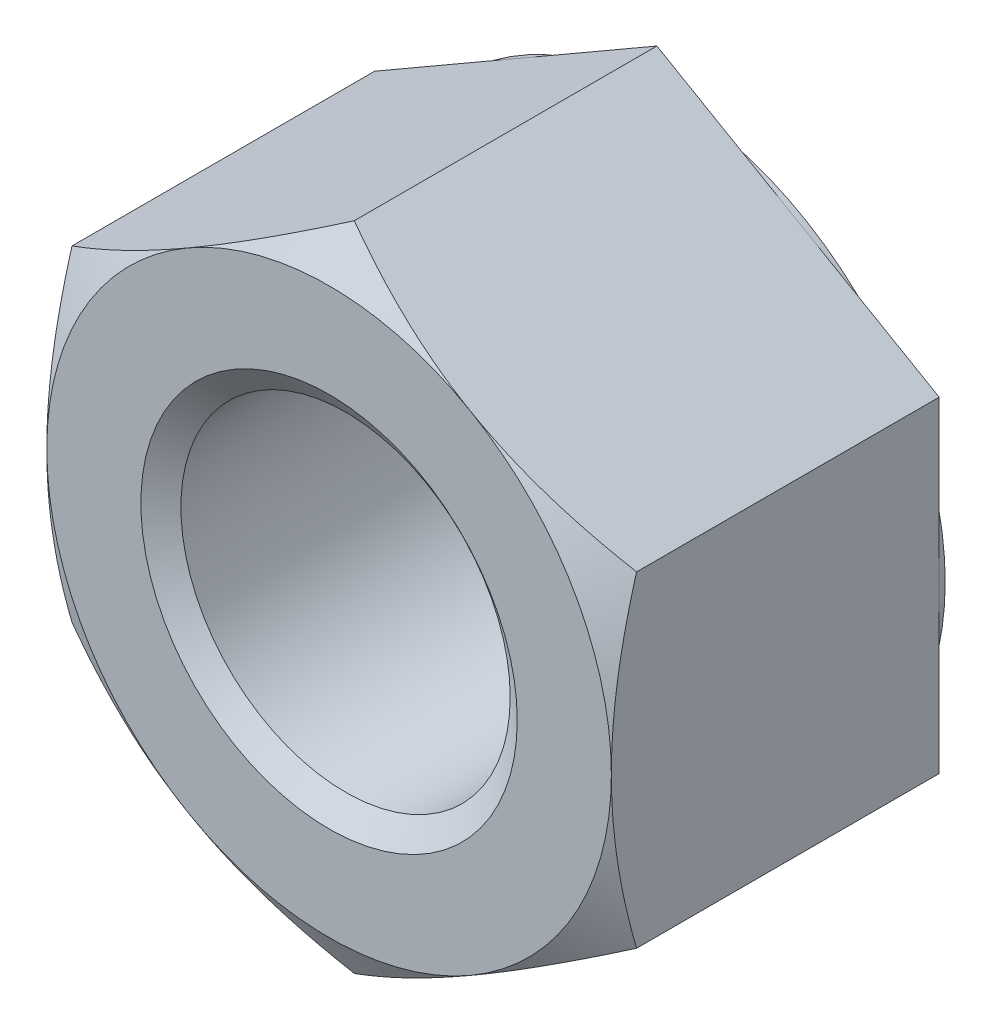
ISO-10303-21;
HEADER;
FILE_DESCRIPTION(('STEP AP214'),'2;1');
FILE_NAME('part.step','',(''),(''),'','','');
FILE_SCHEMA(('AUTOMOTIVE_DESIGN { 1 0 10303 214 1 1 1 1 }'));
ENDSEC;
DATA;
#1=APPLICATION_CONTEXT('core data for automotive mechanical design processes');
#2=APPLICATION_PROTOCOL_DEFINITION('international standard','automotive_design',2000,#1);
#3=PRODUCT_CONTEXT('',#1,'mechanical');
#4=PRODUCT('Part','Part','',(#3));
#5=PRODUCT_RELATED_PRODUCT_CATEGORY('part','',(#4));
#6=PRODUCT_DEFINITION_FORMATION('','',#4);
#7=PRODUCT_DEFINITION_CONTEXT('part definition',#1,'design');
#8=PRODUCT_DEFINITION('design','',#6,#7);
#9=PRODUCT_DEFINITION_SHAPE('','',#8);
#10=(LENGTH_UNIT() NAMED_UNIT(*) SI_UNIT(.MILLI.,.METRE.));
#11=(NAMED_UNIT(*) PLANE_ANGLE_UNIT() SI_UNIT($,.RADIAN.));
#12=(NAMED_UNIT(*) SI_UNIT($,.STERADIAN.) SOLID_ANGLE_UNIT());
#13=UNCERTAINTY_MEASURE_WITH_UNIT(LENGTH_MEASURE(1.E-05),#10,'distance_accuracy_value','');
#14=(GEOMETRIC_REPRESENTATION_CONTEXT(3) GLOBAL_UNCERTAINTY_ASSIGNED_CONTEXT((#13)) GLOBAL_UNIT_ASSIGNED_CONTEXT((#10,
#11,#12)) REPRESENTATION_CONTEXT('',''));
#15=CARTESIAN_POINT('',(0.,0.,0.));
#16=DIRECTION('',(0.,0.,1.));
#17=DIRECTION('',(1.,0.,0.));
#18=AXIS2_PLACEMENT_3D('',#15,#16,#17);
#19=CARTESIAN_POINT('',(0.,0.,-22.5298));
#20=DIRECTION('',(0.,0.,1.));
#21=DIRECTION('',(1.,0.,0.));
#22=AXIS2_PLACEMENT_3D('',#19,#20,#21);
#23=CYLINDRICAL_SURFACE('',#22,11.1125);
#24=CARTESIAN_POINT('',(0.,0.,-1.11157946690791));
#25=DIRECTION('',(0.,0.,1.));
#26=DIRECTION('',(1.,0.,0.));
#27=AXIS2_PLACEMENT_3D('',#24,#25,#26);
#28=CIRCLE('',#27,11.1125);
#29=CARTESIAN_POINT('',(11.1125,0.,-1.11157946690791));
#30=VERTEX_POINT('',#29);
#31=EDGE_CURVE('E151',#30,#30,#28,.F.);
#32=ORIENTED_EDGE('',*,*,#31,.F.);
#33=EDGE_LOOP('',(#32));
#34=FACE_BOUND('',#33,.T.);
#35=CARTESIAN_POINT('',(0.,0.,-21.3928205330921));
#36=DIRECTION('',(0.,0.,-1.));
#37=DIRECTION('',(-1.,0.,0.));
#38=AXIS2_PLACEMENT_3D('',#35,#36,#37);
#39=CIRCLE('',#38,11.1125);
#40=CARTESIAN_POINT('',(-11.1125,0.,-21.3928205330921));
#41=VERTEX_POINT('',#40);
#42=EDGE_CURVE('E39',#41,#41,#39,.F.);
#43=ORIENTED_EDGE('',*,*,#42,.F.);
#44=EDGE_LOOP('',(#43));
#45=FACE_BOUND('',#44,.T.);
#46=ADVANCED_FACE('F34',(#34,#45),#23,.F.);
#47=CARTESIAN_POINT('',(0.,21.9970452561248,-22.5298));
#48=DIRECTION('',(-0.500000000000001,0.866025403784438,0.));
#49=DIRECTION('',(-0.866025403784438,-0.500000000000001,0.));
#50=AXIS2_PLACEMENT_3D('',#47,#48,#49);
#51=PLANE('',#50);
#52=DIRECTION('',(0.,0.,1.));
#53=VECTOR('',#52,1.);
#54=CARTESIAN_POINT('',(-19.05,10.9985226280624,-22.5298));
#55=LINE('',#54,#53);
#56=CARTESIAN_POINT('',(-19.05,10.9985226280624,-22.1234));
#57=VERTEX_POINT('',#56);
#58=CARTESIAN_POINT('',(-19.05,10.9985226280624,-1.70147737193764));
#59=VERTEX_POINT('',#58);
#60=EDGE_CURVE('E283',#57,#59,#55,.T.);
#61=ORIENTED_EDGE('',*,*,#60,.T.);
#62=CARTESIAN_POINT('',(-19.0502,10.9984071580085,-1.70154403912923));
#63=CARTESIAN_POINT('',(-18.6314889424188,11.2401500998157,-1.56198341710823));
#64=CARTESIAN_POINT('',(-18.2111446870423,11.4828359688097,-1.42875584552933));
#65=CARTESIAN_POINT('',(-17.3670855155916,11.9701537586587,-1.17672716507822));
#66=CARTESIAN_POINT('',(-16.9433695394589,12.2147862915388,-1.05793080103128));
#67=CARTESIAN_POINT('',(-16.0917480208183,12.7064702045736,-0.836361403470765));
#68=CARTESIAN_POINT('',(-15.6638350258304,12.9535258874196,-0.733626282713289));
#69=CARTESIAN_POINT('',(-14.8050356703556,13.4493539264829,-0.546385434087813));
#70=CARTESIAN_POINT('',(-14.374149481613,13.6981261835436,-0.461878662220417));
#71=CARTESIAN_POINT('',(-13.5204444881885,14.1910129913057,-0.31468882771764));
#72=CARTESIAN_POINT('',(-13.0976890621094,14.4350909503539,-0.251518592005303));
#73=CARTESIAN_POINT('',(-12.250241089937,14.9243652652118,-0.145596345015131));
#74=CARTESIAN_POINT('',(-11.8255485067157,15.1695616424575,-0.102844726760491));
#75=CARTESIAN_POINT('',(-10.9754499399404,15.6603662788229,-0.0388391678998653));
#76=CARTESIAN_POINT('',(-10.5500454086646,15.9059736994695,-0.017559681721621));
#77=CARTESIAN_POINT('',(-9.6988436900556,16.397415240843,0.00304398488096937));
#78=CARTESIAN_POINT('',(-9.27304651526213,16.6432493543302,0.00236884372942741));
#79=CARTESIAN_POINT('',(-8.47700964232625,17.1028414572046,-0.0194033988503019));
#80=CARTESIAN_POINT('',(-8.10671322507252,17.316632193386,-0.0378455699352607));
#81=CARTESIAN_POINT('',(-7.36700369103291,17.7437036919859,-0.0909844304102515));
#82=CARTESIAN_POINT('',(-6.99759056167259,17.9569844616643,-0.125680887003946));
#83=CARTESIAN_POINT('',(-6.25978756382388,18.3829552210812,-0.210726274890314));
#84=CARTESIAN_POINT('',(-5.89139892582437,18.5956445003966,-0.261089360566667));
#85=CARTESIAN_POINT('',(-5.15637533457961,19.0200105686625,-0.376579300829341));
#86=CARTESIAN_POINT('',(-4.78974037391031,19.2316873618992,-0.441706092858128));
#87=CARTESIAN_POINT('',(-3.6767727159359,19.8742595388301,-0.660888399543256));
#88=CARTESIAN_POINT('',(-2.93366305060604,20.3032941041457,-0.836799169320448));
#89=CARTESIAN_POINT('',(-1.45852420538159,21.1549659135281,-1.23604434094319));
#90=CARTESIAN_POINT('',(-0.726476139694542,21.5776140613123,-1.45928498251532));
#91=CARTESIAN_POINT('',(0.000199999999999758,21.9971607261786,-1.70154403912924));
#92=B_SPLINE_CURVE_WITH_KNOTS('',3,(#62,#63,#64,#65,#66,#67,#68,#69,#70,#71,#72,#73,#74,#75,#76,
#77,#78,#79,#80,#81,#82,#83,#84,#85,#86,#87,#88,#89,#90,#91),.UNSPECIFIED.,.F.,.F.,(4,2,2,2,2,2,
2,2,2,2,2,2,2,2,4),(0.,1.50971559281794,3.01992622800797,4.53364959201314,6.04728623691164,
7.52356313869613,8.99986845512143,10.4744153207586,11.9489166211861,13.2325441548787,
14.5161533048254,15.8009255464228,17.085692344219,19.7118183650732,22.3327898553892),.UNSPECIFIED.);
#93=CARTESIAN_POINT('',(-9.52500000000002,16.4977839420935,0.));
#94=VERTEX_POINT('',#93);
#95=EDGE_CURVE('E137',#59,#94,#92,.T.);
#96=ORIENTED_EDGE('',*,*,#95,.T.);
#97=CARTESIAN_POINT('',(0.,21.9970452561248,-1.70147737193764));
#98=VERTEX_POINT('',#97);
#99=EDGE_CURVE('E164',#94,#98,#92,.T.);
#100=ORIENTED_EDGE('',*,*,#99,.T.);
#101=DIRECTION('',(0.,0.,1.));
#102=VECTOR('',#101,1.);
#103=CARTESIAN_POINT('',(0.,21.9970452561248,-22.5298));
#104=LINE('',#103,#102);
#105=CARTESIAN_POINT('',(0.,21.9970452561248,-22.1234));
#106=VERTEX_POINT('',#105);
#107=EDGE_CURVE('E271',#106,#98,#104,.T.);
#108=ORIENTED_EDGE('',*,*,#107,.F.);
#109=DIRECTION('',(-0.866025403784438,-0.500000000000001,0.));
#110=VECTOR('',#109,1.);
#111=CARTESIAN_POINT('',(0.,21.9970452561248,-22.1234));
#112=LINE('',#111,#110);
#113=CARTESIAN_POINT('',(-9.52500000000002,16.4977839420935,-22.1234));
#114=VERTEX_POINT('',#113);
#115=EDGE_CURVE('E259',#106,#114,#112,.T.);
#116=ORIENTED_EDGE('',*,*,#115,.T.);
#117=EDGE_CURVE('E255',#114,#57,#112,.T.);
#118=ORIENTED_EDGE('',*,*,#117,.T.);
#119=EDGE_LOOP('',(#61,#96,#100,#108,#116,#118));
#120=FACE_BOUND('',#119,.T.);
#121=ADVANCED_FACE('F36',(#120),#51,.T.);
#122=CARTESIAN_POINT('',(19.05,10.9985226280624,-22.5298));
#123=DIRECTION('',(0.500000000000001,0.866025403784438,0.));
#124=DIRECTION('',(-0.866025403784438,0.500000000000001,0.));
#125=AXIS2_PLACEMENT_3D('',#122,#123,#124);
#126=PLANE('',#125);
#127=ORIENTED_EDGE('',*,*,#107,.T.);
#128=CARTESIAN_POINT('',(-0.000200000000000468,21.9971607261786,-1.70154403912924));
#129=CARTESIAN_POINT('',(0.418511057581223,21.7554177843714,-1.56198341710825));
#130=CARTESIAN_POINT('',(0.83885531295774,21.5127319153775,-1.42875584552934));
#131=CARTESIAN_POINT('',(1.68291448440842,21.0254141255284,-1.17672716507823));
#132=CARTESIAN_POINT('',(2.10663046054107,20.7807815926483,-1.05793080103129));
#133=CARTESIAN_POINT('',(2.95825197918165,20.2890976796135,-0.836361403470774));
#134=CARTESIAN_POINT('',(3.38616497416957,20.0420419967675,-0.733626282713298));
#135=CARTESIAN_POINT('',(4.24496432964444,19.5462139577042,-0.546385434087821));
#136=CARTESIAN_POINT('',(4.67585051838703,19.2974417006435,-0.461878662220425));
#137=CARTESIAN_POINT('',(5.52955551181151,18.8045548928814,-0.314688827717646));
#138=CARTESIAN_POINT('',(5.95231093789063,18.5604769338332,-0.251518592005307));
#139=CARTESIAN_POINT('',(6.79975891006299,18.0712026189753,-0.145596345015135));
#140=CARTESIAN_POINT('',(7.22445149328435,17.8260062417296,-0.102844726760495));
#141=CARTESIAN_POINT('',(8.07455006005964,17.3352016053642,-0.0388391678998682));
#142=CARTESIAN_POINT('',(8.49995459133542,17.0895941847176,-0.0175596817216222));
#143=CARTESIAN_POINT('',(9.35115630994441,16.5981526433441,0.00304398488096952));
#144=CARTESIAN_POINT('',(9.77695348473787,16.3523185298569,0.00236884372942737));
#145=CARTESIAN_POINT('',(10.5729903576738,15.8927264269825,-0.0194033988503009));
#146=CARTESIAN_POINT('',(10.9432867749275,15.6789356908011,-0.0378455699352588));
#147=CARTESIAN_POINT('',(11.6829963089671,15.2518641922012,-0.0909844304102479));
#148=CARTESIAN_POINT('',(12.0524094383274,15.0385834225228,-0.125680887003942));
#149=CARTESIAN_POINT('',(12.7902124361761,14.612612663106,-0.21072627489031));
#150=CARTESIAN_POINT('',(13.1586010741756,14.3999233837905,-0.261089360566663));
#151=CARTESIAN_POINT('',(13.8936246654204,13.9755573155246,-0.376579300829336));
#152=CARTESIAN_POINT('',(14.2602596260897,13.7638805222879,-0.441706092858121));
#153=CARTESIAN_POINT('',(15.3732272840641,13.121308345357,-0.660888399543245));
#154=CARTESIAN_POINT('',(16.116336949394,12.6922737800414,-0.836799169320437));
#155=CARTESIAN_POINT('',(17.5914757946184,11.840601970659,-1.23604434094318));
#156=CARTESIAN_POINT('',(18.3235238603055,11.4179538228748,-1.45928498251531));
#157=CARTESIAN_POINT('',(19.0502,10.9984071580085,-1.70154403912923));
#158=B_SPLINE_CURVE_WITH_KNOTS('',3,(#128,#129,#130,#131,#132,#133,#134,#135,#136,#137,#138,
#139,#140,#141,#142,#143,#144,#145,#146,#147,#148,#149,#150,#151,#152,#153,#154,#155,#156,#157),
.UNSPECIFIED.,.F.,.F.,(4,2,2,2,2,2,2,2,2,2,2,2,2,2,4),(0.,1.50971559281794,3.01992622800797,
4.53364959201314,6.04728623691165,7.52356313869614,8.99986845512144,10.4744153207586,
11.9489166211862,13.2325441548787,14.5161533048254,15.8009255464228,17.085692344219,
19.7118183650732,22.3327898553892),.UNSPECIFIED.);
#159=CARTESIAN_POINT('',(9.52500000000002,16.4977839420935,0.));
#160=VERTEX_POINT('',#159);
#161=EDGE_CURVE('E160',#98,#160,#158,.T.);
#162=ORIENTED_EDGE('',*,*,#161,.T.);
#163=CARTESIAN_POINT('',(19.05,10.9985226280624,-1.70147737193764));
#164=VERTEX_POINT('',#163);
#165=EDGE_CURVE('E146',#160,#164,#158,.T.);
#166=ORIENTED_EDGE('',*,*,#165,.T.);
#167=DIRECTION('',(0.,0.,1.));
#168=VECTOR('',#167,1.);
#169=CARTESIAN_POINT('',(19.05,10.9985226280624,-22.5298));
#170=LINE('',#169,#168);
#171=CARTESIAN_POINT('',(19.05,10.9985226280624,-22.1234));
#172=VERTEX_POINT('',#171);
#173=EDGE_CURVE('E159',#172,#164,#170,.T.);
#174=ORIENTED_EDGE('',*,*,#173,.F.);
#175=DIRECTION('',(-0.866025403784438,0.500000000000001,0.));
#176=VECTOR('',#175,1.);
#177=CARTESIAN_POINT('',(19.05,10.9985226280624,-22.1234));
#178=LINE('',#177,#176);
#179=CARTESIAN_POINT('',(9.52500000000002,16.4977839420935,-22.1234));
#180=VERTEX_POINT('',#179);
#181=EDGE_CURVE('E267',#172,#180,#178,.T.);
#182=ORIENTED_EDGE('',*,*,#181,.T.);
#183=EDGE_CURVE('E263',#180,#106,#178,.T.);
#184=ORIENTED_EDGE('',*,*,#183,.T.);
#185=EDGE_LOOP('',(#127,#162,#166,#174,#182,#184));
#186=FACE_BOUND('',#185,.T.);
#187=ADVANCED_FACE('F231',(#186),#126,.T.);
#188=CARTESIAN_POINT('',(19.05,10.9985226280624,-22.5298));
#189=DIRECTION('',(-1.,0.,0.));
#190=DIRECTION('',(0.,0.,1.));
#191=AXIS2_PLACEMENT_3D('',#188,#189,#190);
#192=PLANE('',#191);
#193=CARTESIAN_POINT('',(19.05,-29.169702852179,-9.1159337361584));
#194=CARTESIAN_POINT('',(19.05,-28.7515170158437,-8.91378890432752));
#195=CARTESIAN_POINT('',(19.05,-28.3328257173085,-8.71269026117989));
#196=CARTESIAN_POINT('',(19.05,-27.494325409167,-8.31282549081005));
#197=CARTESIAN_POINT('',(19.05,-27.0745163873414,-8.11405938921735));
#198=CARTESIAN_POINT('',(19.05,-25.813129635616,-7.52156252646637));
#199=CARTESIAN_POINT('',(19.05,-24.9697281338906,-7.1316990962541));
#200=CARTESIAN_POINT('',(19.05,-23.2722707252134,-6.36257122322557));
#201=CARTESIAN_POINT('',(19.05,-22.4181814672043,-5.98338020144302));
#202=CARTESIAN_POINT('',(19.05,-20.7029839633497,-5.24127883376428));
#203=CARTESIAN_POINT('',(19.05,-19.8418760858487,-4.87836763990465));
#204=CARTESIAN_POINT('',(19.05,-18.1005821949281,-4.16885698892381));
#205=CARTESIAN_POINT('',(19.05,-17.2202917493446,-3.82251248896519));
#206=CARTESIAN_POINT('',(19.05,-15.4493217028707,-3.15694792805772));
#207=CARTESIAN_POINT('',(19.05,-14.5586409597487,-2.83773088187278));
#208=CARTESIAN_POINT('',(19.05,-12.7673320093036,-2.2350028083671));
#209=CARTESIAN_POINT('',(19.05,-11.8667295562315,-1.95141586644079));
#210=CARTESIAN_POINT('',(19.05,-10.0526343476905,-1.42914392230641));
#211=CARTESIAN_POINT('',(19.05,-9.13914576283876,-1.19044473497908));
#212=CARTESIAN_POINT('',(19.05,-7.75907469613671,-0.874799864639588));
#213=CARTESIAN_POINT('',(19.05,-7.29731333096127,-0.776636072300688));
#214=CARTESIAN_POINT('',(19.05,-6.37071732035877,-0.595993194228065));
#215=CARTESIAN_POINT('',(19.05,-5.90588274419357,-0.513513756249894));
#216=CARTESIAN_POINT('',(19.05,-4.97345228347657,-0.365701829763012));
#217=CARTESIAN_POINT('',(19.05,-4.50585623113597,-0.300370394368072));
#218=CARTESIAN_POINT('',(19.05,-3.56843861997924,-0.188166673467617));
#219=CARTESIAN_POINT('',(19.05,-3.09861705851875,-0.141294409901034));
#220=CARTESIAN_POINT('',(19.05,-2.16041609237782,-0.0672708899891405));
#221=CARTESIAN_POINT('',(19.05,-1.69204648745221,-0.0399962400218711));
#222=CARTESIAN_POINT('',(19.05,-0.754574655686935,-0.00531133514657671));
#223=CARTESIAN_POINT('',(19.05,-0.285472440023941,0.0020992199014604));
#224=CARTESIAN_POINT('',(19.05,0.652492903955203,-0.00311981807029486));
#225=CARTESIAN_POINT('',(19.05,1.12135606251189,-0.0157438674170599));
#226=CARTESIAN_POINT('',(19.05,2.05813737693965,-0.0607182138392663));
#227=CARTESIAN_POINT('',(19.05,2.52605549030135,-0.0930693792758757));
#228=CARTESIAN_POINT('',(19.05,3.65980250445305,-0.19468009843645));
#229=CARTESIAN_POINT('',(19.05,4.32476458495625,-0.273803719903594));
#230=CARTESIAN_POINT('',(19.05,5.64947952989343,-0.467485362814414));
#231=CARTESIAN_POINT('',(19.05,6.30923160661031,-0.582048641146117));
#232=CARTESIAN_POINT('',(19.05,8.28182382190528,-0.973151819996954));
#233=CARTESIAN_POINT('',(19.05,9.58542312013701,-1.29684470280669));
#234=CARTESIAN_POINT('',(19.05,11.5353898831336,-1.85499845441047));
#235=CARTESIAN_POINT('',(19.05,12.191945455476,-2.05588340149063));
#236=CARTESIAN_POINT('',(19.05,13.498713616712,-2.47768236405905));
#237=CARTESIAN_POINT('',(19.05,14.1489256271383,-2.69859818759323));
#238=CARTESIAN_POINT('',(19.05,15.4397656080649,-3.15575174176008));
#239=CARTESIAN_POINT('',(19.05,16.0804269482461,-3.39189604004687));
#240=CARTESIAN_POINT('',(19.05,17.0373840365627,-3.75633654034205));
#241=CARTESIAN_POINT('',(19.05,17.3556458209396,-3.87949985759098));
#242=CARTESIAN_POINT('',(19.05,17.9909330309769,-4.12895791785129));
#243=CARTESIAN_POINT('',(19.05,18.3079584810038,-4.25525259878292));
#244=CARTESIAN_POINT('',(19.05,18.6244086642404,-4.38297164365513));
#245=B_SPLINE_CURVE_WITH_KNOTS('',3,(#193,#194,#195,#196,#197,#198,#199,#200,#201,#202,#203,
#204,#205,#206,#207,#208,#209,#210,#211,#212,#213,#214,#215,#216,#217,#218,#219,#220,#221,#222,
#223,#224,#225,#226,#227,#228,#229,#230,#231,#232,#233,#234,#235,#236,#237,#238,#239,#240,#241,
#242,#243,#244),.UNSPECIFIED.,.F.,.F.,(4,2,2,2,2,2,2,2,2,2,2,2,2,2,2,2,2,2,2,2,2,2,2,2,2,4),(0.,
1.39343811466813,2.78689152584544,5.57425145066781,8.37756231436863,11.1807269927528,
14.0183059326613,16.856199810853,19.6879407755784,22.5187853636699,23.934802353684,
25.3507875385607,26.766859663288,28.1829334710278,29.5900111205978,30.9970675095624,
32.4037346270206,33.8104636685473,35.8182820070619,37.8263983152062,41.8503661996047,
43.9100054964929,45.9698308879145,48.0180400729539,49.0418117683234,50.0655631834717),.UNSPECIFIED.);
#246=CARTESIAN_POINT('',(19.05,-10.9985226280624,-1.70147737193764));
#247=VERTEX_POINT('',#246);
#248=CARTESIAN_POINT('',(19.05,0.,0.));
#249=VERTEX_POINT('',#248);
#250=EDGE_CURVE('E126',#247,#249,#245,.T.);
#251=ORIENTED_EDGE('',*,*,#250,.F.);
#252=DIRECTION('',(0.,0.,1.));
#253=VECTOR('',#252,1.);
#254=CARTESIAN_POINT('',(19.05,-10.9985226280624,-22.5298));
#255=LINE('',#254,#253);
#256=CARTESIAN_POINT('',(19.05,-10.9985226280624,-22.1234));
#257=VERTEX_POINT('',#256);
#258=EDGE_CURVE('E276',#257,#247,#255,.T.);
#259=ORIENTED_EDGE('',*,*,#258,.F.);
#260=DIRECTION('',(0.,-1.,0.));
#261=VECTOR('',#260,1.);
#262=CARTESIAN_POINT('',(19.05,10.9985226280624,-22.1234));
#263=LINE('',#262,#261);
#264=CARTESIAN_POINT('',(19.05,0.,-22.1234));
#265=VERTEX_POINT('',#264);
#266=EDGE_CURVE('E268',#265,#257,#263,.T.);
#267=ORIENTED_EDGE('',*,*,#266,.F.);
#268=EDGE_CURVE('E270',#172,#265,#263,.T.);
#269=ORIENTED_EDGE('',*,*,#268,.F.);
#270=ORIENTED_EDGE('',*,*,#173,.T.);
#271=EDGE_CURVE('E139',#249,#164,#245,.T.);
#272=ORIENTED_EDGE('',*,*,#271,.F.);
#273=EDGE_LOOP('',(#251,#259,#267,#269,#270,#272));
#274=FACE_BOUND('',#273,.T.);
#275=ADVANCED_FACE('F156',(#274),#192,.F.);
#276=CARTESIAN_POINT('',(0.,-21.9970452561248,-22.5298));
#277=DIRECTION('',(0.500000000000001,-0.866025403784438,0.));
#278=DIRECTION('',(0.866025403784438,0.500000000000001,0.));
#279=AXIS2_PLACEMENT_3D('',#276,#277,#278);
#280=PLANE('',#279);
#281=ORIENTED_EDGE('',*,*,#258,.T.);
#282=CARTESIAN_POINT('',(19.0502,-10.9984071580086,-1.70154403912924));
#283=CARTESIAN_POINT('',(18.6314889424188,-11.2401500998158,-1.56198341710825));
#284=CARTESIAN_POINT('',(18.2111446870423,-11.4828359688097,-1.42875584552934));
#285=CARTESIAN_POINT('',(17.3670855155916,-11.9701537586587,-1.17672716507823));
#286=CARTESIAN_POINT('',(16.9433695394589,-12.2147862915389,-1.05793080103129));
#287=CARTESIAN_POINT('',(16.0917480208183,-12.7064702045737,-0.836361403470778));
#288=CARTESIAN_POINT('',(15.6638350258304,-12.9535258874197,-0.733626282713304));
#289=CARTESIAN_POINT('',(14.8050356703556,-13.449353926483,-0.546385434087829));
#290=CARTESIAN_POINT('',(14.374149481613,-13.6981261835436,-0.461878662220433));
#291=CARTESIAN_POINT('',(13.5204444881885,-14.1910129913058,-0.314688827717657));
#292=CARTESIAN_POINT('',(13.0976890621094,-14.4350909503539,-0.25151859200532));
#293=CARTESIAN_POINT('',(12.250241089937,-14.9243652652118,-0.145596345015151));
#294=CARTESIAN_POINT('',(11.8255485067156,-15.1695616424575,-0.102844726760511));
#295=CARTESIAN_POINT('',(10.9754499399403,-15.660366278823,-0.0388391678998856));
#296=CARTESIAN_POINT('',(10.5500454086646,-15.9059736994695,-0.0175596817216414));
#297=CARTESIAN_POINT('',(9.69884369005559,-16.3974152408431,0.00304398488094663));
#298=CARTESIAN_POINT('',(9.27304651526212,-16.6432493543303,0.00236884372940247));
#299=CARTESIAN_POINT('',(8.47700964232623,-17.1028414572047,-0.019403398850328));
#300=CARTESIAN_POINT('',(8.10671322507251,-17.3166321933861,-0.0378455699352862));
#301=CARTESIAN_POINT('',(7.36700369103289,-17.743703691986,-0.0909844304102776));
#302=CARTESIAN_POINT('',(6.99759056167258,-17.9569844616643,-0.125680887003973));
#303=CARTESIAN_POINT('',(6.25978756382387,-18.3829552210812,-0.210726274890343));
#304=CARTESIAN_POINT('',(5.89139892582436,-18.5956445003966,-0.261089360566696));
#305=CARTESIAN_POINT('',(5.1563753345796,-19.0200105686625,-0.37657930082937));
#306=CARTESIAN_POINT('',(4.7897403739103,-19.2316873618993,-0.441706092858157));
#307=CARTESIAN_POINT('',(3.67677271593589,-19.8742595388301,-0.660888399543286));
#308=CARTESIAN_POINT('',(2.93366305060603,-20.3032941041457,-0.836799169320478));
#309=CARTESIAN_POINT('',(1.45852420538159,-21.1549659135282,-1.23604434094322));
#310=CARTESIAN_POINT('',(0.72647613969454,-21.5776140613123,-1.45928498251535));
#311=CARTESIAN_POINT('',(-0.000200000000002499,-21.9971607261786,-1.70154403912927));
#312=B_SPLINE_CURVE_WITH_KNOTS('',3,(#282,#283,#284,#285,#286,#287,#288,#289,#290,#291,#292,
#293,#294,#295,#296,#297,#298,#299,#300,#301,#302,#303,#304,#305,#306,#307,#308,#309,#310,#311),
.UNSPECIFIED.,.F.,.F.,(4,2,2,2,2,2,2,2,2,2,2,2,2,2,4),(0.,1.50971559281795,3.01992622800797,
4.53364959201315,6.04728623691165,7.52356313869615,8.99986845512145,10.4744153207586,
11.9489166211862,13.2325441548787,14.5161533048254,15.8009255464228,17.085692344219,
19.7118183650732,22.3327898553892),.UNSPECIFIED.);
#313=CARTESIAN_POINT('',(9.52500000000003,-16.4977839420935,0.));
#314=VERTEX_POINT('',#313);
#315=EDGE_CURVE('E132',#247,#314,#312,.T.);
#316=ORIENTED_EDGE('',*,*,#315,.T.);
#317=CARTESIAN_POINT('',(0.,-21.9970452561248,-1.70147737193764));
#318=VERTEX_POINT('',#317);
#319=EDGE_CURVE('E53',#314,#318,#312,.T.);
#320=ORIENTED_EDGE('',*,*,#319,.T.);
#321=DIRECTION('',(0.,0.,1.));
#322=VECTOR('',#321,1.);
#323=CARTESIAN_POINT('',(0.,-21.9970452561248,-22.5298));
#324=LINE('',#323,#322);
#325=CARTESIAN_POINT('',(0.,-21.9970452561248,-22.1234));
#326=VERTEX_POINT('',#325);
#327=EDGE_CURVE('E278',#326,#318,#324,.T.);
#328=ORIENTED_EDGE('',*,*,#327,.F.);
#329=DIRECTION('',(0.866025403784438,0.500000000000001,0.));
#330=VECTOR('',#329,1.);
#331=CARTESIAN_POINT('',(0.,-21.9970452561248,-22.1234));
#332=LINE('',#331,#330);
#333=CARTESIAN_POINT('',(9.52500000000003,-16.4977839420935,-22.1234));
#334=VERTEX_POINT('',#333);
#335=EDGE_CURVE('E260',#326,#334,#332,.T.);
#336=ORIENTED_EDGE('',*,*,#335,.T.);
#337=EDGE_CURVE('E264',#334,#257,#332,.T.);
#338=ORIENTED_EDGE('',*,*,#337,.T.);
#339=EDGE_LOOP('',(#281,#316,#320,#328,#336,#338));
#340=FACE_BOUND('',#339,.T.);
#341=ADVANCED_FACE('F212',(#340),#280,.T.);
#342=CARTESIAN_POINT('',(-19.05,-10.9985226280624,-22.5298));
#343=DIRECTION('',(-0.500000000000001,-0.866025403784438,0.));
#344=DIRECTION('',(0.866025403784438,-0.500000000000001,0.));
#345=AXIS2_PLACEMENT_3D('',#342,#343,#344);
#346=PLANE('',#345);
#347=ORIENTED_EDGE('',*,*,#327,.T.);
#348=CARTESIAN_POINT('',(0.000199999999998265,-21.9971607261786,-1.70154403912927));
#349=CARTESIAN_POINT('',(-0.418511057581227,-21.7554177843715,-1.56198341710828));
#350=CARTESIAN_POINT('',(-0.838855312957744,-21.5127319153775,-1.42875584552937));
#351=CARTESIAN_POINT('',(-1.68291448440843,-21.0254141255285,-1.17672716507826));
#352=CARTESIAN_POINT('',(-2.10663046054108,-20.7807815926483,-1.05793080103132));
#353=CARTESIAN_POINT('',(-2.95825197918166,-20.2890976796135,-0.836361403470803));
#354=CARTESIAN_POINT('',(-3.38616497416957,-20.0420419967675,-0.733626282713327));
#355=CARTESIAN_POINT('',(-4.24496432964445,-19.5462139577042,-0.546385434087849));
#356=CARTESIAN_POINT('',(-4.67585051838704,-19.2974417006436,-0.461878662220452));
#357=CARTESIAN_POINT('',(-5.52955551181152,-18.8045548928814,-0.314688827717672));
#358=CARTESIAN_POINT('',(-5.95231093789064,-18.5604769338333,-0.251518592005333));
#359=CARTESIAN_POINT('',(-6.79975891006301,-18.0712026189754,-0.145596345015161));
#360=CARTESIAN_POINT('',(-7.22445149328437,-17.8260062417297,-0.10284472676052));
#361=CARTESIAN_POINT('',(-8.07455006005966,-17.3352016053642,-0.0388391678998924));
#362=CARTESIAN_POINT('',(-8.49995459133544,-17.0895941847177,-0.0175596817216468));
#363=CARTESIAN_POINT('',(-9.35115630994443,-16.5981526433441,0.00304398488094397));
#364=CARTESIAN_POINT('',(-9.7769534847379,-16.3523185298569,0.00236884372940104));
#365=CARTESIAN_POINT('',(-10.5729903576738,-15.8927264269825,-0.0194033988503276));
#366=CARTESIAN_POINT('',(-10.9432867749275,-15.6789356908011,-0.037845569935285));
#367=CARTESIAN_POINT('',(-11.6829963089671,-15.2518641922012,-0.0909844304102733));
#368=CARTESIAN_POINT('',(-12.0524094383274,-15.0385834225229,-0.125680887003967));
#369=CARTESIAN_POINT('',(-12.7902124361761,-14.612612663106,-0.210726274890334));
#370=CARTESIAN_POINT('',(-13.1586010741756,-14.3999233837906,-0.261089360566687));
#371=CARTESIAN_POINT('',(-13.8936246654204,-13.9755573155247,-0.376579300829358));
#372=CARTESIAN_POINT('',(-14.2602596260897,-13.7638805222879,-0.441706092858143));
#373=CARTESIAN_POINT('',(-15.3732272840641,-13.1213083453571,-0.660888399543267));
#374=CARTESIAN_POINT('',(-16.116336949394,-12.6922737800415,-0.836799169320458));
#375=CARTESIAN_POINT('',(-17.5914757946184,-11.840601970659,-1.2360443409432));
#376=CARTESIAN_POINT('',(-18.3235238603055,-11.4179538228749,-1.45928498251533));
#377=CARTESIAN_POINT('',(-19.0502,-10.9984071580086,-1.70154403912924));
#378=B_SPLINE_CURVE_WITH_KNOTS('',3,(#348,#349,#350,#351,#352,#353,#354,#355,#356,#357,#358,
#359,#360,#361,#362,#363,#364,#365,#366,#367,#368,#369,#370,#371,#372,#373,#374,#375,#376,#377),
.UNSPECIFIED.,.F.,.F.,(4,2,2,2,2,2,2,2,2,2,2,2,2,2,4),(0.,1.50971559281795,3.01992622800797,
4.53364959201315,6.04728623691166,7.52356313869616,8.99986845512146,10.4744153207587,
11.9489166211862,13.2325441548787,14.5161533048255,15.8009255464228,17.085692344219,
19.7118183650732,22.3327898553892),.UNSPECIFIED.);
#379=CARTESIAN_POINT('',(-9.52500000000003,-16.4977839420935,0.));
#380=VERTEX_POINT('',#379);
#381=EDGE_CURVE('E206',#318,#380,#378,.T.);
#382=ORIENTED_EDGE('',*,*,#381,.T.);
#383=CARTESIAN_POINT('',(-19.05,-10.9985226280624,-1.70147737193764));
#384=VERTEX_POINT('',#383);
#385=EDGE_CURVE('E60',#380,#384,#378,.T.);
#386=ORIENTED_EDGE('',*,*,#385,.T.);
#387=DIRECTION('',(0.,0.,1.));
#388=VECTOR('',#387,1.);
#389=CARTESIAN_POINT('',(-19.05,-10.9985226280624,-22.5298));
#390=LINE('',#389,#388);
#391=CARTESIAN_POINT('',(-19.05,-10.9985226280624,-22.1234));
#392=VERTEX_POINT('',#391);
#393=EDGE_CURVE('E281',#392,#384,#390,.T.);
#394=ORIENTED_EDGE('',*,*,#393,.F.);
#395=DIRECTION('',(0.866025403784438,-0.500000000000001,0.));
#396=VECTOR('',#395,1.);
#397=CARTESIAN_POINT('',(-19.05,-10.9985226280624,-22.1234));
#398=LINE('',#397,#396);
#399=CARTESIAN_POINT('',(-9.52500000000003,-16.4977839420935,-22.1234));
#400=VERTEX_POINT('',#399);
#401=EDGE_CURVE('E250',#392,#400,#398,.T.);
#402=ORIENTED_EDGE('',*,*,#401,.T.);
#403=EDGE_CURVE('E256',#400,#326,#398,.T.);
#404=ORIENTED_EDGE('',*,*,#403,.T.);
#405=EDGE_LOOP('',(#347,#382,#386,#394,#402,#404));
#406=FACE_BOUND('',#405,.T.);
#407=ADVANCED_FACE('F208',(#406),#346,.T.);
#408=CARTESIAN_POINT('',(-19.05,10.9985226280624,-22.5298));
#409=DIRECTION('',(-1.,0.,0.));
#410=DIRECTION('',(0.,0.,1.));
#411=AXIS2_PLACEMENT_3D('',#408,#409,#410);
#412=PLANE('',#411);
#413=ORIENTED_EDGE('',*,*,#393,.T.);
#414=CARTESIAN_POINT('',(-19.05,-29.169702852179,-9.1159337361584));
#415=CARTESIAN_POINT('',(-19.05,-28.7515170158437,-8.91378890432753));
#416=CARTESIAN_POINT('',(-19.05,-28.3328257173085,-8.71269026117989));
#417=CARTESIAN_POINT('',(-19.05,-27.494325409167,-8.31282549081006));
#418=CARTESIAN_POINT('',(-19.05,-27.0745163873414,-8.11405938921735));
#419=CARTESIAN_POINT('',(-19.05,-25.813129635616,-7.52156252646637));
#420=CARTESIAN_POINT('',(-19.05,-24.9697281338906,-7.1316990962541));
#421=CARTESIAN_POINT('',(-19.05,-23.2722707252134,-6.36257122322558));
#422=CARTESIAN_POINT('',(-19.05,-22.4181814672043,-5.98338020144302));
#423=CARTESIAN_POINT('',(-19.05,-20.7029839633497,-5.24127883376427));
#424=CARTESIAN_POINT('',(-19.05,-19.8418760858487,-4.87836763990465));
#425=CARTESIAN_POINT('',(-19.05,-18.1005821949281,-4.16885698892381));
#426=CARTESIAN_POINT('',(-19.05,-17.2202917493446,-3.82251248896519));
#427=CARTESIAN_POINT('',(-19.05,-15.4493217028707,-3.15694792805772));
#428=CARTESIAN_POINT('',(-19.05,-14.5586409597487,-2.83773088187278));
#429=CARTESIAN_POINT('',(-19.05,-12.7673320093036,-2.2350028083671));
#430=CARTESIAN_POINT('',(-19.05,-11.8667295562314,-1.95141586644079));
#431=CARTESIAN_POINT('',(-19.05,-10.0526343476905,-1.42914392230641));
#432=CARTESIAN_POINT('',(-19.05,-9.13914576283875,-1.19044473497907));
#433=CARTESIAN_POINT('',(-19.05,-7.7590746961367,-0.874799864639588));
#434=CARTESIAN_POINT('',(-19.05,-7.29731333096126,-0.776636072300688));
#435=CARTESIAN_POINT('',(-19.05,-6.37071732035876,-0.595993194228065));
#436=CARTESIAN_POINT('',(-19.05,-5.90588274419357,-0.513513756249894));
#437=CARTESIAN_POINT('',(-19.05,-4.97345228347656,-0.365701829763012));
#438=CARTESIAN_POINT('',(-19.05,-4.50585623113596,-0.300370394368072));
#439=CARTESIAN_POINT('',(-19.05,-3.56843861997924,-0.188166673467617));
#440=CARTESIAN_POINT('',(-19.05,-3.09861705851875,-0.141294409901035));
#441=CARTESIAN_POINT('',(-19.05,-2.16041609237782,-0.0672708899891429));
#442=CARTESIAN_POINT('',(-19.05,-1.69204648745221,-0.0399962400218731));
#443=CARTESIAN_POINT('',(-19.05,-0.754574655686936,-0.00531133514657857));
#444=CARTESIAN_POINT('',(-19.05,-0.285472440023941,0.00209921990145845));
#445=CARTESIAN_POINT('',(-19.05,0.652492903955204,-0.00311981807029691));
#446=CARTESIAN_POINT('',(-19.05,1.12135606251189,-0.015743867417062));
#447=CARTESIAN_POINT('',(-19.05,2.05813737693965,-0.0607182138392683));
#448=CARTESIAN_POINT('',(-19.05,2.52605549030135,-0.0930693792758775));
#449=CARTESIAN_POINT('',(-19.05,3.65980250445305,-0.194680098436453));
#450=CARTESIAN_POINT('',(-19.05,4.32476458495625,-0.273803719903598));
#451=CARTESIAN_POINT('',(-19.05,5.64947952989344,-0.467485362814418));
#452=CARTESIAN_POINT('',(-19.05,6.30923160661031,-0.58204864114612));
#453=CARTESIAN_POINT('',(-19.05,8.28182382190529,-0.973151819996956));
#454=CARTESIAN_POINT('',(-19.05,9.58542312013702,-1.29684470280669));
#455=CARTESIAN_POINT('',(-19.05,11.5353898831336,-1.85499845441048));
#456=CARTESIAN_POINT('',(-19.05,12.191945455476,-2.05588340149063));
#457=CARTESIAN_POINT('',(-19.05,13.498713616712,-2.47768236405905));
#458=CARTESIAN_POINT('',(-19.05,14.1489256271383,-2.69859818759323));
#459=CARTESIAN_POINT('',(-19.05,15.4397656080649,-3.15575174176009));
#460=CARTESIAN_POINT('',(-19.05,16.0804269482461,-3.39189604004687));
#461=CARTESIAN_POINT('',(-19.05,17.0373840365627,-3.75633654034205));
#462=CARTESIAN_POINT('',(-19.05,17.3556458209396,-3.87949985759098));
#463=CARTESIAN_POINT('',(-19.05,17.9909330309769,-4.1289579178513));
#464=CARTESIAN_POINT('',(-19.05,18.3079584810038,-4.25525259878292));
#465=CARTESIAN_POINT('',(-19.05,18.6244086642404,-4.38297164365514));
#466=B_SPLINE_CURVE_WITH_KNOTS('',3,(#414,#415,#416,#417,#418,#419,#420,#421,#422,#423,#424,
#425,#426,#427,#428,#429,#430,#431,#432,#433,#434,#435,#436,#437,#438,#439,#440,#441,#442,#443,
#444,#445,#446,#447,#448,#449,#450,#451,#452,#453,#454,#455,#456,#457,#458,#459,#460,#461,#462,
#463,#464,#465),.UNSPECIFIED.,.F.,.F.,(4,2,2,2,2,2,2,2,2,2,2,2,2,2,2,2,2,2,2,2,2,2,2,2,2,4),(0.,
1.39343811466813,2.78689152584544,5.57425145066781,8.37756231436865,11.1807269927528,
14.0183059326613,16.856199810853,19.6879407755784,22.5187853636699,23.934802353684,
25.3507875385607,26.766859663288,28.1829334710278,29.5900111205978,30.9970675095624,
32.4037346270206,33.8104636685473,35.8182820070619,37.8263983152062,41.8503661996048,
43.910005496493,45.9698308879145,48.0180400729539,49.0418117683234,50.0655631834717),.UNSPECIFIED.);
#467=CARTESIAN_POINT('',(-19.05,0.,0.));
#468=VERTEX_POINT('',#467);
#469=EDGE_CURVE('E207',#384,#468,#466,.T.);
#470=ORIENTED_EDGE('',*,*,#469,.T.);
#471=EDGE_CURVE('E150',#468,#59,#466,.T.);
#472=ORIENTED_EDGE('',*,*,#471,.T.);
#473=ORIENTED_EDGE('',*,*,#60,.F.);
#474=DIRECTION('',(0.,-1.,0.));
#475=VECTOR('',#474,1.);
#476=CARTESIAN_POINT('',(-19.05,10.9985226280624,-22.1234));
#477=LINE('',#476,#475);
#478=CARTESIAN_POINT('',(-19.05,0.,-22.1234));
#479=VERTEX_POINT('',#478);
#480=EDGE_CURVE('E290',#57,#479,#477,.T.);
#481=ORIENTED_EDGE('',*,*,#480,.T.);
#482=EDGE_CURVE('E288',#479,#392,#477,.T.);
#483=ORIENTED_EDGE('',*,*,#482,.T.);
#484=EDGE_LOOP('',(#413,#470,#472,#473,#481,#483));
#485=FACE_BOUND('',#484,.T.);
#486=ADVANCED_FACE('F211',(#485),#412,.T.);
#487=CARTESIAN_POINT('',(-38.1,0.,0.));
#488=DIRECTION('',(0.,0.,1.));
#489=DIRECTION('',(1.,0.,0.));
#490=AXIS2_PLACEMENT_3D('',#487,#488,#489);
#491=PLANE('',#490);
#492=CARTESIAN_POINT('',(0.,0.,0.));
#493=DIRECTION('',(0.,0.,1.));
#494=DIRECTION('',(1.,0.,0.));
#495=AXIS2_PLACEMENT_3D('',#492,#493,#494);
#496=CIRCLE('',#495,12.7);
#497=CARTESIAN_POINT('',(12.7,0.,0.));
#498=VERTEX_POINT('',#497);
#499=EDGE_CURVE('E293',#498,#498,#496,.T.);
#500=ORIENTED_EDGE('',*,*,#499,.F.);
#501=EDGE_LOOP('',(#500));
#502=FACE_BOUND('',#501,.T.);
#503=CARTESIAN_POINT('',(0.,0.,0.));
#504=DIRECTION('',(0.,0.,1.));
#505=DIRECTION('',(1.,0.,0.));
#506=AXIS2_PLACEMENT_3D('',#503,#504,#505);
#507=CIRCLE('',#506,19.05);
#508=EDGE_CURVE('E11',#249,#314,#507,.F.);
#509=ORIENTED_EDGE('',*,*,#508,.F.);
#510=CARTESIAN_POINT('',(0.,0.,0.));
#511=DIRECTION('',(0.,0.,1.));
#512=DIRECTION('',(1.,0.,0.));
#513=AXIS2_PLACEMENT_3D('',#510,#511,#512);
#514=CIRCLE('',#513,19.05);
#515=EDGE_CURVE('E143',#249,#160,#514,.T.);
#516=ORIENTED_EDGE('',*,*,#515,.T.);
#517=EDGE_CURVE('E46',#94,#160,#507,.F.);
#518=ORIENTED_EDGE('',*,*,#517,.F.);
#519=EDGE_CURVE('E358',#468,#94,#507,.F.);
#520=ORIENTED_EDGE('',*,*,#519,.F.);
#521=EDGE_CURVE('E360',#380,#468,#507,.F.);
#522=ORIENTED_EDGE('',*,*,#521,.F.);
#523=EDGE_CURVE('E44',#314,#380,#507,.F.);
#524=ORIENTED_EDGE('',*,*,#523,.F.);
#525=EDGE_LOOP('',(#509,#516,#518,#520,#522,#524));
#526=FACE_BOUND('',#525,.T.);
#527=ADVANCED_FACE('F153',(#502,#526),#491,.T.);
#528=CARTESIAN_POINT('',(-38.1,0.,-22.5298));
#529=DIRECTION('',(0.,0.,1.));
#530=DIRECTION('',(1.,0.,0.));
#531=AXIS2_PLACEMENT_3D('',#528,#529,#530);
#532=PLANE('',#531);
#533=CARTESIAN_POINT('',(0.,0.,-22.5298));
#534=DIRECTION('',(0.,0.,1.));
#535=DIRECTION('',(1.,0.,0.));
#536=AXIS2_PLACEMENT_3D('',#533,#534,#535);
#537=CIRCLE('',#536,12.7);
#538=CARTESIAN_POINT('',(12.7,0.,-22.5298));
#539=VERTEX_POINT('',#538);
#540=EDGE_CURVE('E294',#539,#539,#537,.F.);
#541=ORIENTED_EDGE('',*,*,#540,.F.);
#542=EDGE_LOOP('',(#541));
#543=FACE_BOUND('',#542,.T.);
#544=CARTESIAN_POINT('',(0.,0.,-22.5298));
#545=DIRECTION('',(0.,0.,1.));
#546=DIRECTION('',(1.,0.,0.));
#547=AXIS2_PLACEMENT_3D('',#544,#545,#546);
#548=CIRCLE('',#547,19.05);
#549=CARTESIAN_POINT('',(19.05,0.,-22.5298));
#550=VERTEX_POINT('',#549);
#551=EDGE_CURVE('E274',#550,#550,#548,.F.);
#552=ORIENTED_EDGE('',*,*,#551,.T.);
#553=EDGE_LOOP('',(#552));
#554=FACE_BOUND('',#553,.T.);
#555=ADVANCED_FACE('F221',(#543,#554),#532,.F.);
#556=CARTESIAN_POINT('',(0.,31.9970452561248,-22.1234));
#557=DIRECTION('',(0.,0.,-1.));
#558=DIRECTION('',(-1.,0.,0.));
#559=AXIS2_PLACEMENT_3D('',#556,#557,#558);
#560=PLANE('',#559);
#561=ORIENTED_EDGE('',*,*,#268,.T.);
#562=CARTESIAN_POINT('',(0.,0.,-22.1234));
#563=DIRECTION('',(0.,0.,1.));
#564=DIRECTION('',(1.,0.,0.));
#565=AXIS2_PLACEMENT_3D('',#562,#563,#564);
#566=CIRCLE('',#565,19.05);
#567=EDGE_CURVE('E247',#265,#180,#566,.T.);
#568=ORIENTED_EDGE('',*,*,#567,.T.);
#569=ORIENTED_EDGE('',*,*,#181,.F.);
#570=EDGE_LOOP('',(#561,#568,#569));
#571=FACE_BOUND('',#570,.T.);
#572=ADVANCED_FACE('F238',(#571),#560,.T.);
#573=ORIENTED_EDGE('',*,*,#266,.T.);
#574=ORIENTED_EDGE('',*,*,#337,.F.);
#575=EDGE_CURVE('E252',#334,#265,#566,.T.);
#576=ORIENTED_EDGE('',*,*,#575,.T.);
#577=EDGE_LOOP('',(#573,#574,#576));
#578=FACE_BOUND('',#577,.T.);
#579=ADVANCED_FACE('F336',(#578),#560,.T.);
#580=EDGE_CURVE('E251',#180,#114,#566,.T.);
#581=ORIENTED_EDGE('',*,*,#580,.T.);
#582=ORIENTED_EDGE('',*,*,#115,.F.);
#583=ORIENTED_EDGE('',*,*,#183,.F.);
#584=EDGE_LOOP('',(#581,#582,#583));
#585=FACE_BOUND('',#584,.T.);
#586=ADVANCED_FACE('F344',(#585),#560,.T.);
#587=ORIENTED_EDGE('',*,*,#403,.F.);
#588=EDGE_CURVE('E375',#400,#334,#566,.T.);
#589=ORIENTED_EDGE('',*,*,#588,.T.);
#590=ORIENTED_EDGE('',*,*,#335,.F.);
#591=EDGE_LOOP('',(#587,#589,#590));
#592=FACE_BOUND('',#591,.T.);
#593=ADVANCED_FACE('F339',(#592),#560,.T.);
#594=EDGE_CURVE('E348',#114,#479,#566,.T.);
#595=ORIENTED_EDGE('',*,*,#594,.T.);
#596=ORIENTED_EDGE('',*,*,#480,.F.);
#597=ORIENTED_EDGE('',*,*,#117,.F.);
#598=EDGE_LOOP('',(#595,#596,#597));
#599=FACE_BOUND('',#598,.T.);
#600=ADVANCED_FACE('F330',(#599),#560,.T.);
#601=CARTESIAN_POINT('',(0.,0.,0.));
#602=DIRECTION('',(0.,0.,1.));
#603=DIRECTION('',(1.,0.,0.));
#604=AXIS2_PLACEMENT_3D('',#601,#602,#603);
#605=CYLINDRICAL_SURFACE('',#604,19.05);
#606=ORIENTED_EDGE('',*,*,#551,.F.);
#607=EDGE_LOOP('',(#606));
#608=FACE_BOUND('',#607,.T.);
#609=ORIENTED_EDGE('',*,*,#580,.F.);
#610=ORIENTED_EDGE('',*,*,#567,.F.);
#611=ORIENTED_EDGE('',*,*,#575,.F.);
#612=ORIENTED_EDGE('',*,*,#588,.F.);
#613=EDGE_CURVE('E354',#479,#400,#566,.T.);
#614=ORIENTED_EDGE('',*,*,#613,.F.);
#615=ORIENTED_EDGE('',*,*,#594,.F.);
#616=EDGE_LOOP('',(#609,#610,#611,#612,#614,#615));
#617=FACE_BOUND('',#616,.T.);
#618=ADVANCED_FACE('F191',(#608,#617),#605,.T.);
#619=ORIENTED_EDGE('',*,*,#482,.F.);
#620=ORIENTED_EDGE('',*,*,#613,.T.);
#621=ORIENTED_EDGE('',*,*,#401,.F.);
#622=EDGE_LOOP('',(#619,#620,#621));
#623=FACE_BOUND('',#622,.T.);
#624=ADVANCED_FACE('F236',(#623),#560,.T.);
#625=CARTESIAN_POINT('',(0.,0.,0.));
#626=DIRECTION('',(0.,0.,-1.));
#627=DIRECTION('',(-1.,0.,0.));
#628=AXIS2_PLACEMENT_3D('',#625,#626,#627);
#629=CONICAL_SURFACE('',#628,19.05,1.0471975511966);
#630=ORIENTED_EDGE('',*,*,#515,.F.);
#631=ORIENTED_EDGE('',*,*,#271,.T.);
#632=ORIENTED_EDGE('',*,*,#165,.F.);
#633=EDGE_LOOP('',(#630,#631,#632));
#634=FACE_BOUND('',#633,.T.);
#635=ADVANCED_FACE('F144',(#634),#629,.T.);
#636=ORIENTED_EDGE('',*,*,#517,.T.);
#637=ORIENTED_EDGE('',*,*,#161,.F.);
#638=ORIENTED_EDGE('',*,*,#99,.F.);
#639=EDGE_LOOP('',(#636,#637,#638));
#640=FACE_BOUND('',#639,.T.);
#641=ADVANCED_FACE('F188',(#640),#629,.T.);
#642=ORIENTED_EDGE('',*,*,#471,.F.);
#643=ORIENTED_EDGE('',*,*,#519,.T.);
#644=ORIENTED_EDGE('',*,*,#95,.F.);
#645=EDGE_LOOP('',(#642,#643,#644));
#646=FACE_BOUND('',#645,.T.);
#647=ADVANCED_FACE('F187',(#646),#629,.T.);
#648=ORIENTED_EDGE('',*,*,#521,.T.);
#649=ORIENTED_EDGE('',*,*,#469,.F.);
#650=ORIENTED_EDGE('',*,*,#385,.F.);
#651=EDGE_LOOP('',(#648,#649,#650));
#652=FACE_BOUND('',#651,.T.);
#653=ADVANCED_FACE('F181',(#652),#629,.T.);
#654=ORIENTED_EDGE('',*,*,#523,.T.);
#655=ORIENTED_EDGE('',*,*,#381,.F.);
#656=ORIENTED_EDGE('',*,*,#319,.F.);
#657=EDGE_LOOP('',(#654,#655,#656));
#658=FACE_BOUND('',#657,.T.);
#659=ADVANCED_FACE('F186',(#658),#629,.T.);
#660=ORIENTED_EDGE('',*,*,#250,.T.);
#661=ORIENTED_EDGE('',*,*,#508,.T.);
#662=ORIENTED_EDGE('',*,*,#315,.F.);
#663=EDGE_LOOP('',(#660,#661,#662));
#664=FACE_BOUND('',#663,.T.);
#665=ADVANCED_FACE('F128',(#664),#629,.T.);
#666=CARTESIAN_POINT('',(0.,0.,-1.22273741359871));
#667=DIRECTION('',(0.,0.,1.));
#668=DIRECTION('',(1.,0.,0.));
#669=AXIS2_PLACEMENT_3D('',#666,#667,#668);
#670=CONICAL_SURFACE('',#669,10.95375,0.959931088596882);
#671=ORIENTED_EDGE('',*,*,#499,.T.);
#672=EDGE_LOOP('',(#671));
#673=FACE_BOUND('',#672,.T.);
#674=ORIENTED_EDGE('',*,*,#31,.T.);
#675=EDGE_LOOP('',(#674));
#676=FACE_BOUND('',#675,.T.);
#677=ADVANCED_FACE('F189',(#673,#676),#670,.F.);
#678=CARTESIAN_POINT('',(0.,0.,-22.5044));
#679=DIRECTION('',(0.,0.,-1.));
#680=DIRECTION('',(-1.,0.,0.));
#681=AXIS2_PLACEMENT_3D('',#678,#679,#680);
#682=CONICAL_SURFACE('',#681,12.7,0.95993108859688);
#683=CARTESIAN_POINT('',(0.,0.,-22.5044));
#684=DIRECTION('',(0.,0.,1.));
#685=DIRECTION('',(1.,0.,0.));
#686=AXIS2_PLACEMENT_3D('',#683,#684,#685);
#687=CIRCLE('',#686,12.7);
#688=CARTESIAN_POINT('',(12.7,0.,-22.5044));
#689=VERTEX_POINT('',#688);
#690=EDGE_CURVE('E296',#689,#689,#687,.T.);
#691=ORIENTED_EDGE('',*,*,#690,.F.);
#692=EDGE_LOOP('',(#691));
#693=FACE_BOUND('',#692,.T.);
#694=ORIENTED_EDGE('',*,*,#42,.T.);
#695=EDGE_LOOP('',(#694));
#696=FACE_BOUND('',#695,.T.);
#697=ADVANCED_FACE('F310',(#693,#696),#682,.F.);
#698=CARTESIAN_POINT('',(0.,0.,-25.0375057290932));
#699=DIRECTION('',(0.,0.,1.));
#700=DIRECTION('',(1.,0.,0.));
#701=AXIS2_PLACEMENT_3D('',#698,#699,#700);
#702=CYLINDRICAL_SURFACE('',#701,12.7);
#703=ORIENTED_EDGE('',*,*,#690,.T.);
#704=EDGE_LOOP('',(#703));
#705=FACE_BOUND('',#704,.T.);
#706=ORIENTED_EDGE('',*,*,#540,.T.);
#707=EDGE_LOOP('',(#706));
#708=FACE_BOUND('',#707,.T.);
#709=ADVANCED_FACE('F315',(#705,#708),#702,.F.);
#710=CLOSED_SHELL('',(#46,#121,#187,#275,#341,#407,#486,#527,#555,#572,#579,#586,#593,#600,#618,
#624,#635,#641,#647,#653,#659,#665,#677,#697,#709));
#711=MANIFOLD_SOLID_BREP('B2',#710);
#712=ADVANCED_BREP_SHAPE_REPRESENTATION('',(#18,#711),#14);
#713=SHAPE_DEFINITION_REPRESENTATION(#9,#712);
ENDSEC;
END-ISO-10303-21;
